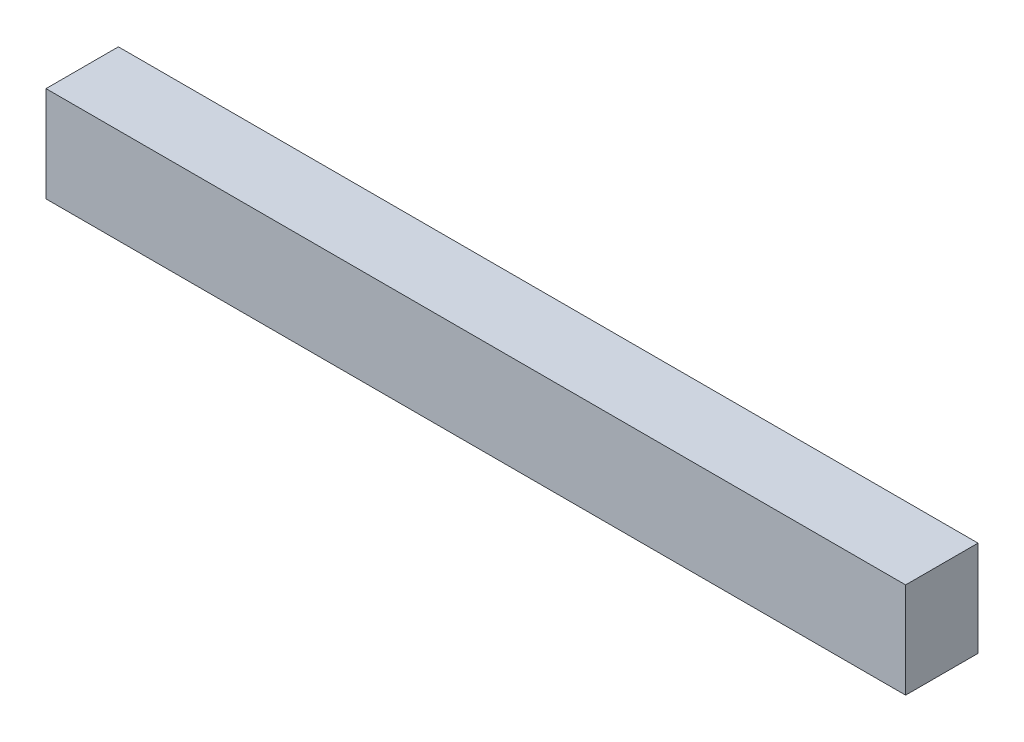
ISO-10303-21;
HEADER;
FILE_DESCRIPTION(('STEP AP214'),'2;1');
FILE_NAME('part.step','',(''),(''),'','','');
FILE_SCHEMA(('AUTOMOTIVE_DESIGN { 1 0 10303 214 1 1 1 1 }'));
ENDSEC;
DATA;
#1=APPLICATION_CONTEXT('core data for automotive mechanical design processes');
#2=APPLICATION_PROTOCOL_DEFINITION('international standard','automotive_design',2000,#1);
#3=PRODUCT_CONTEXT('',#1,'mechanical');
#4=PRODUCT('Part','Part','',(#3));
#5=PRODUCT_RELATED_PRODUCT_CATEGORY('part','',(#4));
#6=PRODUCT_DEFINITION_FORMATION('','',#4);
#7=PRODUCT_DEFINITION_CONTEXT('part definition',#1,'design');
#8=PRODUCT_DEFINITION('design','',#6,#7);
#9=PRODUCT_DEFINITION_SHAPE('','',#8);
#10=(LENGTH_UNIT() NAMED_UNIT(*) SI_UNIT(.MILLI.,.METRE.));
#11=(NAMED_UNIT(*) PLANE_ANGLE_UNIT() SI_UNIT($,.RADIAN.));
#12=(NAMED_UNIT(*) SI_UNIT($,.STERADIAN.) SOLID_ANGLE_UNIT());
#13=UNCERTAINTY_MEASURE_WITH_UNIT(LENGTH_MEASURE(1.E-05),#10,'distance_accuracy_value','');
#14=(GEOMETRIC_REPRESENTATION_CONTEXT(3) GLOBAL_UNCERTAINTY_ASSIGNED_CONTEXT((#13)) GLOBAL_UNIT_ASSIGNED_CONTEXT((#10,
#11,#12)) REPRESENTATION_CONTEXT('',''));
#15=CARTESIAN_POINT('',(0.,0.,0.));
#16=DIRECTION('',(0.,0.,1.));
#17=DIRECTION('',(1.,0.,0.));
#18=AXIS2_PLACEMENT_3D('',#15,#16,#17);
#19=CARTESIAN_POINT('',(10.8585,-1.2065,1.8288));
#20=DIRECTION('',(-1.,0.,0.));
#21=DIRECTION('',(0.,0.,1.));
#22=AXIS2_PLACEMENT_3D('',#19,#20,#21);
#23=PLANE('',#22);
#24=DIRECTION('',(0.,1.,0.));
#25=VECTOR('',#24,1.);
#26=CARTESIAN_POINT('',(10.8585,-1.2065,0.));
#27=LINE('',#26,#25);
#28=CARTESIAN_POINT('',(10.8585,-1.2065,0.));
#29=VERTEX_POINT('',#28);
#30=CARTESIAN_POINT('',(10.8585,1.2065,0.));
#31=VERTEX_POINT('',#30);
#32=EDGE_CURVE('E98',#29,#31,#27,.T.);
#33=ORIENTED_EDGE('',*,*,#32,.T.);
#34=DIRECTION('',(0.,0.,-1.));
#35=VECTOR('',#34,1.);
#36=CARTESIAN_POINT('',(10.8585,1.2065,1.8288));
#37=LINE('',#36,#35);
#38=CARTESIAN_POINT('',(10.8585,1.2065,1.8288));
#39=VERTEX_POINT('',#38);
#40=EDGE_CURVE('E11',#39,#31,#37,.T.);
#41=ORIENTED_EDGE('',*,*,#40,.F.);
#42=DIRECTION('',(0.,1.,0.));
#43=VECTOR('',#42,1.);
#44=CARTESIAN_POINT('',(10.8585,-1.2065,1.8288));
#45=LINE('',#44,#43);
#46=CARTESIAN_POINT('',(10.8585,-1.2065,1.8288));
#47=VERTEX_POINT('',#46);
#48=EDGE_CURVE('E86',#47,#39,#45,.T.);
#49=ORIENTED_EDGE('',*,*,#48,.F.);
#50=DIRECTION('',(0.,0.,-1.));
#51=VECTOR('',#50,1.);
#52=CARTESIAN_POINT('',(10.8585,-1.2065,1.8288));
#53=LINE('',#52,#51);
#54=EDGE_CURVE('E94',#47,#29,#53,.T.);
#55=ORIENTED_EDGE('',*,*,#54,.T.);
#56=EDGE_LOOP('',(#33,#41,#49,#55));
#57=FACE_BOUND('',#56,.T.);
#58=ADVANCED_FACE('F35',(#57),#23,.F.);
#59=CARTESIAN_POINT('',(-10.8585,1.2065,1.8288));
#60=DIRECTION('',(0.,-1.,0.));
#61=DIRECTION('',(0.,0.,-1.));
#62=AXIS2_PLACEMENT_3D('',#59,#60,#61);
#63=PLANE('',#62);
#64=DIRECTION('',(-1.,0.,0.));
#65=VECTOR('',#64,1.);
#66=CARTESIAN_POINT('',(-10.8585,1.2065,0.));
#67=LINE('',#66,#65);
#68=CARTESIAN_POINT('',(-10.8585,1.2065,0.));
#69=VERTEX_POINT('',#68);
#70=EDGE_CURVE('E90',#31,#69,#67,.T.);
#71=ORIENTED_EDGE('',*,*,#70,.T.);
#72=DIRECTION('',(0.,0.,-1.));
#73=VECTOR('',#72,1.);
#74=CARTESIAN_POINT('',(-10.8585,1.2065,1.8288));
#75=LINE('',#74,#73);
#76=CARTESIAN_POINT('',(-10.8585,1.2065,1.8288));
#77=VERTEX_POINT('',#76);
#78=EDGE_CURVE('E43',#77,#69,#75,.T.);
#79=ORIENTED_EDGE('',*,*,#78,.F.);
#80=DIRECTION('',(-1.,0.,0.));
#81=VECTOR('',#80,1.);
#82=CARTESIAN_POINT('',(-10.8585,1.2065,1.8288));
#83=LINE('',#82,#81);
#84=EDGE_CURVE('E81',#39,#77,#83,.T.);
#85=ORIENTED_EDGE('',*,*,#84,.F.);
#86=ORIENTED_EDGE('',*,*,#40,.T.);
#87=EDGE_LOOP('',(#71,#79,#85,#86));
#88=FACE_BOUND('',#87,.T.);
#89=ADVANCED_FACE('F89',(#88),#63,.F.);
#90=CARTESIAN_POINT('',(-10.8585,-1.2065,1.8288));
#91=DIRECTION('',(1.,0.,0.));
#92=DIRECTION('',(0.,0.,-1.));
#93=AXIS2_PLACEMENT_3D('',#90,#91,#92);
#94=PLANE('',#93);
#95=DIRECTION('',(0.,-1.,0.));
#96=VECTOR('',#95,1.);
#97=CARTESIAN_POINT('',(-10.8585,-1.2065,0.));
#98=LINE('',#97,#96);
#99=CARTESIAN_POINT('',(-10.8585,-1.2065,0.));
#100=VERTEX_POINT('',#99);
#101=EDGE_CURVE('E68',#69,#100,#98,.T.);
#102=ORIENTED_EDGE('',*,*,#101,.T.);
#103=DIRECTION('',(0.,0.,-1.));
#104=VECTOR('',#103,1.);
#105=CARTESIAN_POINT('',(-10.8585,-1.2065,1.8288));
#106=LINE('',#105,#104);
#107=CARTESIAN_POINT('',(-10.8585,-1.2065,1.8288));
#108=VERTEX_POINT('',#107);
#109=EDGE_CURVE('E91',#108,#100,#106,.T.);
#110=ORIENTED_EDGE('',*,*,#109,.F.);
#111=DIRECTION('',(0.,-1.,0.));
#112=VECTOR('',#111,1.);
#113=CARTESIAN_POINT('',(-10.8585,-1.2065,1.8288));
#114=LINE('',#113,#112);
#115=EDGE_CURVE('E84',#77,#108,#114,.T.);
#116=ORIENTED_EDGE('',*,*,#115,.F.);
#117=ORIENTED_EDGE('',*,*,#78,.T.);
#118=EDGE_LOOP('',(#102,#110,#116,#117));
#119=FACE_BOUND('',#118,.T.);
#120=ADVANCED_FACE('F92',(#119),#94,.F.);
#121=CARTESIAN_POINT('',(-10.8585,-1.2065,1.8288));
#122=DIRECTION('',(0.,1.,0.));
#123=DIRECTION('',(0.,0.,1.));
#124=AXIS2_PLACEMENT_3D('',#121,#122,#123);
#125=PLANE('',#124);
#126=DIRECTION('',(1.,0.,0.));
#127=VECTOR('',#126,1.);
#128=CARTESIAN_POINT('',(-10.8585,-1.2065,0.));
#129=LINE('',#128,#127);
#130=EDGE_CURVE('E74',#100,#29,#129,.T.);
#131=ORIENTED_EDGE('',*,*,#130,.T.);
#132=ORIENTED_EDGE('',*,*,#54,.F.);
#133=DIRECTION('',(1.,0.,0.));
#134=VECTOR('',#133,1.);
#135=CARTESIAN_POINT('',(-10.8585,-1.2065,1.8288));
#136=LINE('',#135,#134);
#137=EDGE_CURVE('E51',#108,#47,#136,.T.);
#138=ORIENTED_EDGE('',*,*,#137,.F.);
#139=ORIENTED_EDGE('',*,*,#109,.T.);
#140=EDGE_LOOP('',(#131,#132,#138,#139));
#141=FACE_BOUND('',#140,.T.);
#142=ADVANCED_FACE('F105',(#141),#125,.F.);
#143=CARTESIAN_POINT('',(0.,0.,1.8288));
#144=DIRECTION('',(0.,0.,-1.));
#145=DIRECTION('',(-1.,0.,0.));
#146=AXIS2_PLACEMENT_3D('',#143,#144,#145);
#147=PLANE('',#146);
#148=ORIENTED_EDGE('',*,*,#48,.T.);
#149=ORIENTED_EDGE('',*,*,#84,.T.);
#150=ORIENTED_EDGE('',*,*,#115,.T.);
#151=ORIENTED_EDGE('',*,*,#137,.T.);
#152=EDGE_LOOP('',(#148,#149,#150,#151));
#153=FACE_BOUND('',#152,.T.);
#154=ADVANCED_FACE('F82',(#153),#147,.F.);
#155=CARTESIAN_POINT('',(0.,0.,0.));
#156=DIRECTION('',(0.,0.,-1.));
#157=DIRECTION('',(-1.,0.,0.));
#158=AXIS2_PLACEMENT_3D('',#155,#156,#157);
#159=PLANE('',#158);
#160=ORIENTED_EDGE('',*,*,#32,.F.);
#161=ORIENTED_EDGE('',*,*,#130,.F.);
#162=ORIENTED_EDGE('',*,*,#101,.F.);
#163=ORIENTED_EDGE('',*,*,#70,.F.);
#164=EDGE_LOOP('',(#160,#161,#162,#163));
#165=FACE_BOUND('',#164,.T.);
#166=ADVANCED_FACE('F108',(#165),#159,.T.);
#167=CLOSED_SHELL('',(#58,#89,#120,#142,#154,#166));
#168=MANIFOLD_SOLID_BREP('B2',#167);
#169=ADVANCED_BREP_SHAPE_REPRESENTATION('',(#18,#168),#14);
#170=SHAPE_DEFINITION_REPRESENTATION(#9,#169);
ENDSEC;
END-ISO-10303-21;
